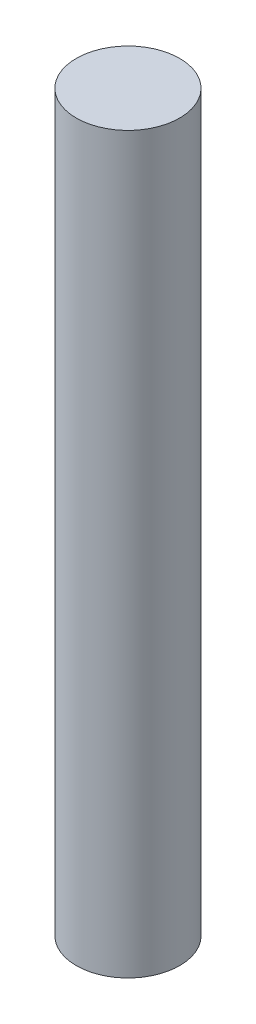
ISO-10303-21;
HEADER;
FILE_DESCRIPTION(('STEP AP214'),'2;1');
FILE_NAME('part.step','',(''),(''),'','','');
FILE_SCHEMA(('AUTOMOTIVE_DESIGN { 1 0 10303 214 1 1 1 1 }'));
ENDSEC;
DATA;
#1=APPLICATION_CONTEXT('core data for automotive mechanical design processes');
#2=APPLICATION_PROTOCOL_DEFINITION('international standard','automotive_design',2000,#1);
#3=PRODUCT_CONTEXT('',#1,'mechanical');
#4=PRODUCT('Part','Part','',(#3));
#5=PRODUCT_RELATED_PRODUCT_CATEGORY('part','',(#4));
#6=PRODUCT_DEFINITION_FORMATION('','',#4);
#7=PRODUCT_DEFINITION_CONTEXT('part definition',#1,'design');
#8=PRODUCT_DEFINITION('design','',#6,#7);
#9=PRODUCT_DEFINITION_SHAPE('','',#8);
#10=(LENGTH_UNIT() NAMED_UNIT(*) SI_UNIT(.MILLI.,.METRE.));
#11=(NAMED_UNIT(*) PLANE_ANGLE_UNIT() SI_UNIT($,.RADIAN.));
#12=(NAMED_UNIT(*) SI_UNIT($,.STERADIAN.) SOLID_ANGLE_UNIT());
#13=UNCERTAINTY_MEASURE_WITH_UNIT(LENGTH_MEASURE(1.E-05),#10,'distance_accuracy_value','');
#14=(GEOMETRIC_REPRESENTATION_CONTEXT(3) GLOBAL_UNCERTAINTY_ASSIGNED_CONTEXT((#13)) GLOBAL_UNIT_ASSIGNED_CONTEXT((#10,
#11,#12)) REPRESENTATION_CONTEXT('',''));
#15=CARTESIAN_POINT('',(0.,0.,0.));
#16=DIRECTION('',(0.,0.,1.));
#17=DIRECTION('',(1.,0.,0.));
#18=AXIS2_PLACEMENT_3D('',#15,#16,#17);
#19=CARTESIAN_POINT('',(0.,7.1,0.));
#20=DIRECTION('',(0.,-1.,0.));
#21=DIRECTION('',(0.,0.,-1.));
#22=AXIS2_PLACEMENT_3D('',#19,#20,#21);
#23=CYLINDRICAL_SURFACE('',#22,0.5);
#24=CARTESIAN_POINT('',(0.,7.1,0.));
#25=DIRECTION('',(0.,1.,0.));
#26=DIRECTION('',(0.,0.,1.));
#27=AXIS2_PLACEMENT_3D('',#24,#25,#26);
#28=CIRCLE('',#27,0.5);
#29=CARTESIAN_POINT('',(0.,7.1,0.5));
#30=VERTEX_POINT('',#29);
#31=EDGE_CURVE('E10',#30,#30,#28,.T.);
#32=ORIENTED_EDGE('',*,*,#31,.F.);
#33=EDGE_LOOP('',(#32));
#34=FACE_BOUND('',#33,.T.);
#35=CARTESIAN_POINT('',(0.,0.,0.));
#36=DIRECTION('',(0.,1.,0.));
#37=DIRECTION('',(0.,0.,1.));
#38=AXIS2_PLACEMENT_3D('',#35,#36,#37);
#39=CIRCLE('',#38,0.5);
#40=CARTESIAN_POINT('',(0.,0.,0.5));
#41=VERTEX_POINT('',#40);
#42=EDGE_CURVE('E43',#41,#41,#39,.T.);
#43=ORIENTED_EDGE('',*,*,#42,.T.);
#44=EDGE_LOOP('',(#43));
#45=FACE_BOUND('',#44,.T.);
#46=ADVANCED_FACE('F40',(#34,#45),#23,.T.);
#47=CARTESIAN_POINT('',(0.,7.1,0.));
#48=DIRECTION('',(0.,1.,0.));
#49=DIRECTION('',(0.,0.,1.));
#50=AXIS2_PLACEMENT_3D('',#47,#48,#49);
#51=PLANE('',#50);
#52=ORIENTED_EDGE('',*,*,#31,.T.);
#53=EDGE_LOOP('',(#52));
#54=FACE_BOUND('',#53,.T.);
#55=ADVANCED_FACE('F57',(#54),#51,.T.);
#56=CARTESIAN_POINT('',(0.,0.,0.));
#57=DIRECTION('',(0.,1.,0.));
#58=DIRECTION('',(0.,0.,1.));
#59=AXIS2_PLACEMENT_3D('',#56,#57,#58);
#60=PLANE('',#59);
#61=ORIENTED_EDGE('',*,*,#42,.F.);
#62=EDGE_LOOP('',(#61));
#63=FACE_BOUND('',#62,.T.);
#64=ADVANCED_FACE('F55',(#63),#60,.F.);
#65=CLOSED_SHELL('',(#46,#55,#64));
#66=MANIFOLD_SOLID_BREP('B2',#65);
#67=ADVANCED_BREP_SHAPE_REPRESENTATION('',(#18,#66),#14);
#68=SHAPE_DEFINITION_REPRESENTATION(#9,#67);
ENDSEC;
END-ISO-10303-21;
